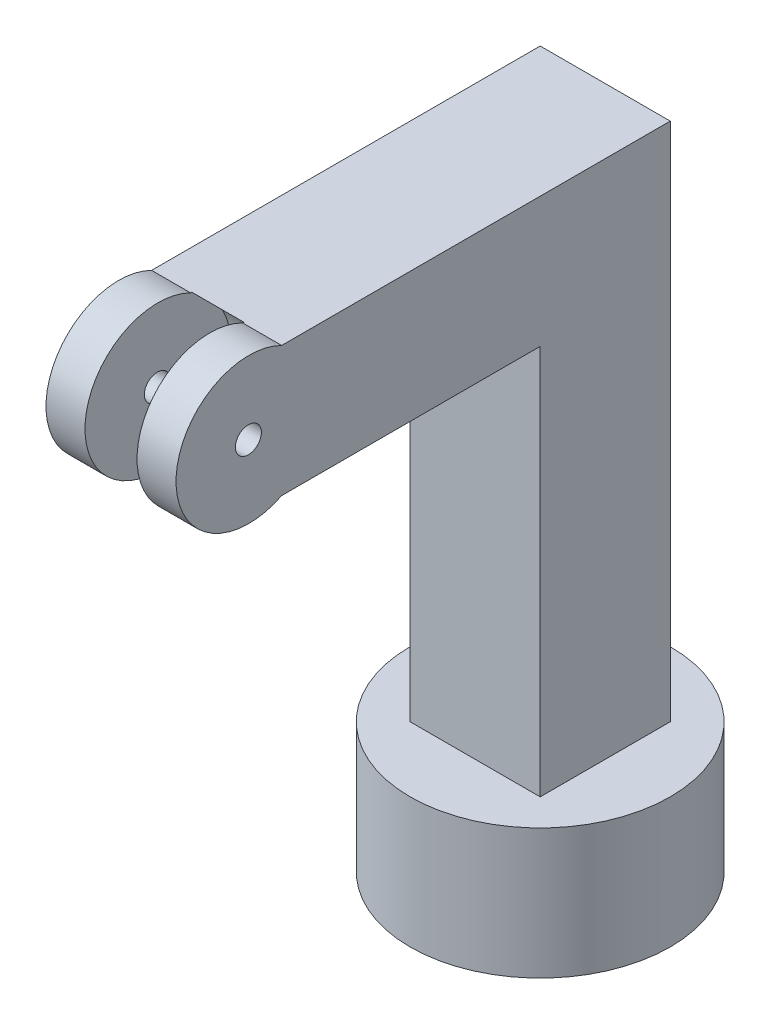
ISO-10303-21;
HEADER;
FILE_DESCRIPTION(('STEP AP214'),'2;1');
FILE_NAME('part.step','',(''),(''),'','','');
FILE_SCHEMA(('AUTOMOTIVE_DESIGN { 1 0 10303 214 1 1 1 1 }'));
ENDSEC;
DATA;
#1=APPLICATION_CONTEXT('core data for automotive mechanical design processes');
#2=APPLICATION_PROTOCOL_DEFINITION('international standard','automotive_design',2000,#1);
#3=PRODUCT_CONTEXT('',#1,'mechanical');
#4=PRODUCT('Part','Part','',(#3));
#5=PRODUCT_RELATED_PRODUCT_CATEGORY('part','',(#4));
#6=PRODUCT_DEFINITION_FORMATION('','',#4);
#7=PRODUCT_DEFINITION_CONTEXT('part definition',#1,'design');
#8=PRODUCT_DEFINITION('design','',#6,#7);
#9=PRODUCT_DEFINITION_SHAPE('','',#8);
#10=(LENGTH_UNIT() NAMED_UNIT(*) SI_UNIT(.MILLI.,.METRE.));
#11=(NAMED_UNIT(*) PLANE_ANGLE_UNIT() SI_UNIT($,.RADIAN.));
#12=(NAMED_UNIT(*) SI_UNIT($,.STERADIAN.) SOLID_ANGLE_UNIT());
#13=UNCERTAINTY_MEASURE_WITH_UNIT(LENGTH_MEASURE(1.E-05),#10,'distance_accuracy_value','');
#14=(GEOMETRIC_REPRESENTATION_CONTEXT(3) GLOBAL_UNCERTAINTY_ASSIGNED_CONTEXT((#13)) GLOBAL_UNIT_ASSIGNED_CONTEXT((#10,
#11,#12)) REPRESENTATION_CONTEXT('',''));
#15=CARTESIAN_POINT('',(0.,0.,0.));
#16=DIRECTION('',(0.,0.,1.));
#17=DIRECTION('',(1.,0.,0.));
#18=AXIS2_PLACEMENT_3D('',#15,#16,#17);
#19=CARTESIAN_POINT('',(0.,125.,0.));
#20=DIRECTION('',(0.,-1.,0.));
#21=DIRECTION('',(0.,0.,-1.));
#22=AXIS2_PLACEMENT_3D('',#19,#20,#21);
#23=PLANE('',#22);
#24=DIRECTION('',(0.,0.,1.));
#25=VECTOR('',#24,1.);
#26=CARTESIAN_POINT('',(-5.,125.,0.));
#27=LINE('',#26,#25);
#28=CARTESIAN_POINT('',(-5.,125.,61.9640635273143));
#29=VERTEX_POINT('',#28);
#30=CARTESIAN_POINT('',(-5.,125.,62.1952398935408));
#31=VERTEX_POINT('',#30);
#32=EDGE_CURVE('E131',#29,#31,#27,.T.);
#33=ORIENTED_EDGE('',*,*,#32,.F.);
#34=DIRECTION('',(1.,0.,0.));
#35=VECTOR('',#34,1.);
#36=CARTESIAN_POINT('',(-5.,125.,61.9640635273143));
#37=LINE('',#36,#35);
#38=CARTESIAN_POINT('',(5.,125.,61.9640635273143));
#39=VERTEX_POINT('',#38);
#40=EDGE_CURVE('E124',#29,#39,#37,.T.);
#41=ORIENTED_EDGE('',*,*,#40,.T.);
#42=DIRECTION('',(0.,0.,1.));
#43=VECTOR('',#42,1.);
#44=CARTESIAN_POINT('',(5.,125.,0.));
#45=LINE('',#44,#43);
#46=CARTESIAN_POINT('',(5.,125.,62.1952398935408));
#47=VERTEX_POINT('',#46);
#48=EDGE_CURVE('E113',#39,#47,#45,.T.);
#49=ORIENTED_EDGE('',*,*,#48,.T.);
#50=DIRECTION('',(-1.,0.,0.));
#51=VECTOR('',#50,1.);
#52=CARTESIAN_POINT('',(12.5,125.,62.1952398935408));
#53=LINE('',#52,#51);
#54=CARTESIAN_POINT('',(12.5,125.,62.1952398935408));
#55=VERTEX_POINT('',#54);
#56=EDGE_CURVE('E60',#55,#47,#53,.T.);
#57=ORIENTED_EDGE('',*,*,#56,.F.);
#58=DIRECTION('',(0.,0.,-1.));
#59=VECTOR('',#58,1.);
#60=CARTESIAN_POINT('',(12.5,125.,-12.5));
#61=LINE('',#60,#59);
#62=CARTESIAN_POINT('',(12.5,125.,-12.5));
#63=VERTEX_POINT('',#62);
#64=EDGE_CURVE('E161',#55,#63,#61,.T.);
#65=ORIENTED_EDGE('',*,*,#64,.T.);
#66=DIRECTION('',(-1.,0.,0.));
#67=VECTOR('',#66,1.);
#68=CARTESIAN_POINT('',(12.5,125.,-12.5));
#69=LINE('',#68,#67);
#70=CARTESIAN_POINT('',(-12.5,125.,-12.5));
#71=VERTEX_POINT('',#70);
#72=EDGE_CURVE('E164',#63,#71,#69,.T.);
#73=ORIENTED_EDGE('',*,*,#72,.T.);
#74=DIRECTION('',(0.,0.,1.));
#75=VECTOR('',#74,1.);
#76=CARTESIAN_POINT('',(-12.5,125.,-12.5));
#77=LINE('',#76,#75);
#78=CARTESIAN_POINT('',(-12.5,125.,62.1952398935408));
#79=VERTEX_POINT('',#78);
#80=EDGE_CURVE('E158',#71,#79,#77,.T.);
#81=ORIENTED_EDGE('',*,*,#80,.T.);
#82=EDGE_CURVE('E141',#31,#79,#53,.T.);
#83=ORIENTED_EDGE('',*,*,#82,.F.);
#84=EDGE_LOOP('',(#33,#41,#49,#57,#65,#73,#81,#83));
#85=FACE_BOUND('',#84,.T.);
#86=ADVANCED_FACE('F36',(#85),#23,.F.);
#87=CARTESIAN_POINT('',(-12.5,100.,62.5));
#88=DIRECTION('',(0.,1.,0.));
#89=DIRECTION('',(0.,0.,1.));
#90=AXIS2_PLACEMENT_3D('',#87,#88,#89);
#91=PLANE('',#90);
#92=DIRECTION('',(0.,0.,-1.));
#93=VECTOR('',#92,1.);
#94=CARTESIAN_POINT('',(-5.,100.,62.5));
#95=LINE('',#94,#93);
#96=CARTESIAN_POINT('',(-5.,100.,62.1952398935408));
#97=VERTEX_POINT('',#96);
#98=CARTESIAN_POINT('',(-5.,100.,61.9640635273143));
#99=VERTEX_POINT('',#98);
#100=EDGE_CURVE('E119',#97,#99,#95,.T.);
#101=ORIENTED_EDGE('',*,*,#100,.F.);
#102=DIRECTION('',(-1.,0.,0.));
#103=VECTOR('',#102,1.);
#104=CARTESIAN_POINT('',(12.5,100.,62.1952398935408));
#105=LINE('',#104,#103);
#106=CARTESIAN_POINT('',(-12.5,100.,62.1952398935408));
#107=VERTEX_POINT('',#106);
#108=EDGE_CURVE('E193',#107,#97,#105,.F.);
#109=ORIENTED_EDGE('',*,*,#108,.F.);
#110=DIRECTION('',(0.,0.,-1.));
#111=VECTOR('',#110,1.);
#112=CARTESIAN_POINT('',(-12.5,100.,62.5));
#113=LINE('',#112,#111);
#114=CARTESIAN_POINT('',(-12.5,100.,12.5));
#115=VERTEX_POINT('',#114);
#116=EDGE_CURVE('E149',#107,#115,#113,.T.);
#117=ORIENTED_EDGE('',*,*,#116,.T.);
#118=DIRECTION('',(1.,0.,0.));
#119=VECTOR('',#118,1.);
#120=CARTESIAN_POINT('',(-12.5,100.,12.5));
#121=LINE('',#120,#119);
#122=CARTESIAN_POINT('',(12.5,100.,12.5));
#123=VERTEX_POINT('',#122);
#124=EDGE_CURVE('E144',#115,#123,#121,.T.);
#125=ORIENTED_EDGE('',*,*,#124,.T.);
#126=DIRECTION('',(0.,0.,-1.));
#127=VECTOR('',#126,1.);
#128=CARTESIAN_POINT('',(12.5,100.,62.5));
#129=LINE('',#128,#127);
#130=CARTESIAN_POINT('',(12.5,100.,62.1952398935408));
#131=VERTEX_POINT('',#130);
#132=EDGE_CURVE('E147',#131,#123,#129,.T.);
#133=ORIENTED_EDGE('',*,*,#132,.F.);
#134=CARTESIAN_POINT('',(5.,100.,62.1952398935408));
#135=VERTEX_POINT('',#134);
#136=EDGE_CURVE('E190',#135,#131,#105,.F.);
#137=ORIENTED_EDGE('',*,*,#136,.F.);
#138=DIRECTION('',(0.,0.,-1.));
#139=VECTOR('',#138,1.);
#140=CARTESIAN_POINT('',(5.,100.,62.5));
#141=LINE('',#140,#139);
#142=CARTESIAN_POINT('',(5.,100.,61.9640635273143));
#143=VERTEX_POINT('',#142);
#144=EDGE_CURVE('E52',#135,#143,#141,.T.);
#145=ORIENTED_EDGE('',*,*,#144,.T.);
#146=DIRECTION('',(1.,0.,0.));
#147=VECTOR('',#146,1.);
#148=CARTESIAN_POINT('',(-5.,100.,61.9640635273143));
#149=LINE('',#148,#147);
#150=EDGE_CURVE('E11',#143,#99,#149,.F.);
#151=ORIENTED_EDGE('',*,*,#150,.T.);
#152=EDGE_LOOP('',(#101,#109,#117,#125,#133,#137,#145,#151));
#153=FACE_BOUND('',#152,.T.);
#154=ADVANCED_FACE('F203',(#153),#91,.F.);
#155=CARTESIAN_POINT('',(12.5,112.5,68.5));
#156=DIRECTION('',(-1.,0.,0.));
#157=DIRECTION('',(0.,0.,1.));
#158=AXIS2_PLACEMENT_3D('',#155,#156,#157);
#159=CYLINDRICAL_SURFACE('',#158,14.);
#160=CARTESIAN_POINT('',(-5.,112.5,68.5));
#161=DIRECTION('',(1.,0.,0.));
#162=DIRECTION('',(0.,0.,-1.));
#163=AXIS2_PLACEMENT_3D('',#160,#161,#162);
#164=CIRCLE('',#163,14.);
#165=EDGE_CURVE('E45',#31,#97,#164,.T.);
#166=ORIENTED_EDGE('',*,*,#165,.F.);
#167=ORIENTED_EDGE('',*,*,#82,.T.);
#168=CARTESIAN_POINT('',(-12.5,112.5,68.5));
#169=DIRECTION('',(1.,0.,0.));
#170=DIRECTION('',(0.,0.,-1.));
#171=AXIS2_PLACEMENT_3D('',#168,#169,#170);
#172=CIRCLE('',#171,14.);
#173=EDGE_CURVE('E132',#79,#107,#172,.T.);
#174=ORIENTED_EDGE('',*,*,#173,.T.);
#175=ORIENTED_EDGE('',*,*,#108,.T.);
#176=EDGE_LOOP('',(#166,#167,#174,#175));
#177=FACE_BOUND('',#176,.T.);
#178=ADVANCED_FACE('F205',(#177),#159,.T.);
#179=CARTESIAN_POINT('',(12.5,125.,12.5));
#180=DIRECTION('',(0.,0.,-1.));
#181=DIRECTION('',(-1.,0.,0.));
#182=AXIS2_PLACEMENT_3D('',#179,#180,#181);
#183=PLANE('',#182);
#184=ORIENTED_EDGE('',*,*,#124,.F.);
#185=DIRECTION('',(0.,-1.,0.));
#186=VECTOR('',#185,1.);
#187=CARTESIAN_POINT('',(-12.5,125.,12.5));
#188=LINE('',#187,#186);
#189=CARTESIAN_POINT('',(-12.5,25.,12.5));
#190=VERTEX_POINT('',#189);
#191=EDGE_CURVE('E184',#115,#190,#188,.T.);
#192=ORIENTED_EDGE('',*,*,#191,.T.);
#193=DIRECTION('',(1.,0.,0.));
#194=VECTOR('',#193,1.);
#195=CARTESIAN_POINT('',(12.5,25.,12.5));
#196=LINE('',#195,#194);
#197=CARTESIAN_POINT('',(12.5,25.,12.5));
#198=VERTEX_POINT('',#197);
#199=EDGE_CURVE('E169',#190,#198,#196,.T.);
#200=ORIENTED_EDGE('',*,*,#199,.T.);
#201=DIRECTION('',(0.,-1.,0.));
#202=VECTOR('',#201,1.);
#203=CARTESIAN_POINT('',(12.5,125.,12.5));
#204=LINE('',#203,#202);
#205=EDGE_CURVE('E182',#123,#198,#204,.T.);
#206=ORIENTED_EDGE('',*,*,#205,.F.);
#207=EDGE_LOOP('',(#184,#192,#200,#206));
#208=FACE_BOUND('',#207,.T.);
#209=ADVANCED_FACE('F215',(#208),#183,.F.);
#210=CARTESIAN_POINT('',(0.,25.,0.));
#211=DIRECTION('',(0.,-1.,0.));
#212=DIRECTION('',(0.,0.,-1.));
#213=AXIS2_PLACEMENT_3D('',#210,#211,#212);
#214=CYLINDRICAL_SURFACE('',#213,25.);
#215=CARTESIAN_POINT('',(0.,25.,0.));
#216=DIRECTION('',(0.,1.,0.));
#217=DIRECTION('',(0.,0.,1.));
#218=AXIS2_PLACEMENT_3D('',#215,#216,#217);
#219=CIRCLE('',#218,25.);
#220=CARTESIAN_POINT('',(0.,25.,25.));
#221=VERTEX_POINT('',#220);
#222=EDGE_CURVE('E187',#221,#221,#219,.T.);
#223=ORIENTED_EDGE('',*,*,#222,.F.);
#224=EDGE_LOOP('',(#223));
#225=FACE_BOUND('',#224,.T.);
#226=CARTESIAN_POINT('',(0.,0.,0.));
#227=DIRECTION('',(0.,1.,0.));
#228=DIRECTION('',(0.,0.,1.));
#229=AXIS2_PLACEMENT_3D('',#226,#227,#228);
#230=CIRCLE('',#229,25.);
#231=CARTESIAN_POINT('',(0.,0.,25.));
#232=VERTEX_POINT('',#231);
#233=EDGE_CURVE('E186',#232,#232,#230,.T.);
#234=ORIENTED_EDGE('',*,*,#233,.T.);
#235=EDGE_LOOP('',(#234));
#236=FACE_BOUND('',#235,.T.);
#237=ADVANCED_FACE('F38',(#225,#236),#214,.T.);
#238=CARTESIAN_POINT('',(0.,25.,0.));
#239=DIRECTION('',(0.,1.,0.));
#240=DIRECTION('',(0.,0.,1.));
#241=AXIS2_PLACEMENT_3D('',#238,#239,#240);
#242=PLANE('',#241);
#243=DIRECTION('',(0.,0.,1.));
#244=VECTOR('',#243,1.);
#245=CARTESIAN_POINT('',(-12.5,25.,-12.5));
#246=LINE('',#245,#244);
#247=CARTESIAN_POINT('',(-12.5,25.,-12.5));
#248=VERTEX_POINT('',#247);
#249=EDGE_CURVE('E155',#248,#190,#246,.T.);
#250=ORIENTED_EDGE('',*,*,#249,.F.);
#251=DIRECTION('',(-1.,0.,0.));
#252=VECTOR('',#251,1.);
#253=CARTESIAN_POINT('',(12.5,25.,-12.5));
#254=LINE('',#253,#252);
#255=CARTESIAN_POINT('',(12.5,25.,-12.5));
#256=VERTEX_POINT('',#255);
#257=EDGE_CURVE('E162',#256,#248,#254,.T.);
#258=ORIENTED_EDGE('',*,*,#257,.F.);
#259=DIRECTION('',(0.,0.,-1.));
#260=VECTOR('',#259,1.);
#261=CARTESIAN_POINT('',(12.5,25.,-12.5));
#262=LINE('',#261,#260);
#263=EDGE_CURVE('E172',#198,#256,#262,.T.);
#264=ORIENTED_EDGE('',*,*,#263,.F.);
#265=ORIENTED_EDGE('',*,*,#199,.F.);
#266=EDGE_LOOP('',(#250,#258,#264,#265));
#267=FACE_BOUND('',#266,.T.);
#268=ORIENTED_EDGE('',*,*,#222,.T.);
#269=EDGE_LOOP('',(#268));
#270=FACE_BOUND('',#269,.T.);
#271=ADVANCED_FACE('F222',(#267,#270),#242,.T.);
#272=CARTESIAN_POINT('',(0.,0.,0.));
#273=DIRECTION('',(0.,1.,0.));
#274=DIRECTION('',(0.,0.,1.));
#275=AXIS2_PLACEMENT_3D('',#272,#273,#274);
#276=PLANE('',#275);
#277=CARTESIAN_POINT('',(0.,0.,0.));
#278=DIRECTION('',(0.,-1.,0.));
#279=DIRECTION('',(0.,0.,-1.));
#280=AXIS2_PLACEMENT_3D('',#277,#278,#279);
#281=CIRCLE('',#280,5.);
#282=CARTESIAN_POINT('',(0.,0.,-5.));
#283=VERTEX_POINT('',#282);
#284=EDGE_CURVE('E151',#283,#283,#281,.T.);
#285=ORIENTED_EDGE('',*,*,#284,.F.);
#286=EDGE_LOOP('',(#285));
#287=FACE_BOUND('',#286,.T.);
#288=ORIENTED_EDGE('',*,*,#233,.F.);
#289=EDGE_LOOP('',(#288));
#290=FACE_BOUND('',#289,.T.);
#291=ADVANCED_FACE('F263',(#287,#290),#276,.F.);
#292=CARTESIAN_POINT('',(-12.5,125.,-12.5));
#293=DIRECTION('',(1.,0.,0.));
#294=DIRECTION('',(0.,0.,-1.));
#295=AXIS2_PLACEMENT_3D('',#292,#293,#294);
#296=PLANE('',#295);
#297=CARTESIAN_POINT('',(-12.5,112.5,68.5952398935408));
#298=DIRECTION('',(1.,0.,0.));
#299=DIRECTION('',(0.,0.,-1.));
#300=AXIS2_PLACEMENT_3D('',#297,#298,#299);
#301=CIRCLE('',#300,2.50000000000001);
#302=CARTESIAN_POINT('',(-12.5,112.5,66.0952398935407));
#303=VERTEX_POINT('',#302);
#304=EDGE_CURVE('E127',#303,#303,#301,.T.);
#305=ORIENTED_EDGE('',*,*,#304,.T.);
#306=EDGE_LOOP('',(#305));
#307=FACE_BOUND('',#306,.T.);
#308=ORIENTED_EDGE('',*,*,#116,.F.);
#309=ORIENTED_EDGE('',*,*,#173,.F.);
#310=ORIENTED_EDGE('',*,*,#80,.F.);
#311=DIRECTION('',(0.,-1.,0.));
#312=VECTOR('',#311,1.);
#313=CARTESIAN_POINT('',(-12.5,125.,-12.5));
#314=LINE('',#313,#312);
#315=EDGE_CURVE('E166',#71,#248,#314,.T.);
#316=ORIENTED_EDGE('',*,*,#315,.T.);
#317=ORIENTED_EDGE('',*,*,#249,.T.);
#318=ORIENTED_EDGE('',*,*,#191,.F.);
#319=EDGE_LOOP('',(#308,#309,#310,#316,#317,#318));
#320=FACE_BOUND('',#319,.T.);
#321=ADVANCED_FACE('F209',(#307,#320),#296,.F.);
#322=CARTESIAN_POINT('',(12.5,125.,-12.5));
#323=DIRECTION('',(-1.,0.,0.));
#324=DIRECTION('',(0.,0.,1.));
#325=AXIS2_PLACEMENT_3D('',#322,#323,#324);
#326=PLANE('',#325);
#327=CARTESIAN_POINT('',(12.5,112.5,68.5952398935408));
#328=DIRECTION('',(-1.,0.,0.));
#329=DIRECTION('',(0.,0.,1.));
#330=AXIS2_PLACEMENT_3D('',#327,#328,#329);
#331=CIRCLE('',#330,2.50000000000001);
#332=CARTESIAN_POINT('',(12.5,112.5,71.0952398935408));
#333=VERTEX_POINT('',#332);
#334=EDGE_CURVE('E237',#333,#333,#331,.T.);
#335=ORIENTED_EDGE('',*,*,#334,.T.);
#336=EDGE_LOOP('',(#335));
#337=FACE_BOUND('',#336,.T.);
#338=ORIENTED_EDGE('',*,*,#64,.F.);
#339=CARTESIAN_POINT('',(12.5,112.5,68.5));
#340=DIRECTION('',(1.,0.,0.));
#341=DIRECTION('',(0.,0.,-1.));
#342=AXIS2_PLACEMENT_3D('',#339,#340,#341);
#343=CIRCLE('',#342,14.);
#344=EDGE_CURVE('E135',#55,#131,#343,.T.);
#345=ORIENTED_EDGE('',*,*,#344,.T.);
#346=ORIENTED_EDGE('',*,*,#132,.T.);
#347=ORIENTED_EDGE('',*,*,#205,.T.);
#348=ORIENTED_EDGE('',*,*,#263,.T.);
#349=DIRECTION('',(0.,-1.,0.));
#350=VECTOR('',#349,1.);
#351=CARTESIAN_POINT('',(12.5,125.,-12.5));
#352=LINE('',#351,#350);
#353=EDGE_CURVE('E179',#63,#256,#352,.T.);
#354=ORIENTED_EDGE('',*,*,#353,.F.);
#355=EDGE_LOOP('',(#338,#345,#346,#347,#348,#354));
#356=FACE_BOUND('',#355,.T.);
#357=ADVANCED_FACE('F219',(#337,#356),#326,.F.);
#358=CARTESIAN_POINT('',(12.5,125.,-12.5));
#359=DIRECTION('',(0.,0.,1.));
#360=DIRECTION('',(1.,0.,0.));
#361=AXIS2_PLACEMENT_3D('',#358,#359,#360);
#362=PLANE('',#361);
#363=ORIENTED_EDGE('',*,*,#257,.T.);
#364=ORIENTED_EDGE('',*,*,#315,.F.);
#365=ORIENTED_EDGE('',*,*,#72,.F.);
#366=ORIENTED_EDGE('',*,*,#353,.T.);
#367=EDGE_LOOP('',(#363,#364,#365,#366));
#368=FACE_BOUND('',#367,.T.);
#369=ADVANCED_FACE('F226',(#368),#362,.F.);
#370=CARTESIAN_POINT('',(0.,10.,0.));
#371=DIRECTION('',(0.,-1.,0.));
#372=DIRECTION('',(0.,0.,-1.));
#373=AXIS2_PLACEMENT_3D('',#370,#371,#372);
#374=CYLINDRICAL_SURFACE('',#373,5.);
#375=CARTESIAN_POINT('',(0.,10.,0.));
#376=DIRECTION('',(0.,-1.,0.));
#377=DIRECTION('',(0.,0.,-1.));
#378=AXIS2_PLACEMENT_3D('',#375,#376,#377);
#379=CIRCLE('',#378,5.);
#380=CARTESIAN_POINT('',(0.,10.,-5.));
#381=VERTEX_POINT('',#380);
#382=EDGE_CURVE('E152',#381,#381,#379,.T.);
#383=ORIENTED_EDGE('',*,*,#382,.F.);
#384=EDGE_LOOP('',(#383));
#385=FACE_BOUND('',#384,.T.);
#386=ORIENTED_EDGE('',*,*,#284,.T.);
#387=EDGE_LOOP('',(#386));
#388=FACE_BOUND('',#387,.T.);
#389=ADVANCED_FACE('F261',(#385,#388),#374,.F.);
#390=CARTESIAN_POINT('',(0.,10.,0.));
#391=DIRECTION('',(0.,-1.,0.));
#392=DIRECTION('',(0.,0.,-1.));
#393=AXIS2_PLACEMENT_3D('',#390,#391,#392);
#394=PLANE('',#393);
#395=ORIENTED_EDGE('',*,*,#382,.T.);
#396=EDGE_LOOP('',(#395));
#397=FACE_BOUND('',#396,.T.);
#398=ADVANCED_FACE('F276',(#397),#394,.T.);
#399=ORIENTED_EDGE('',*,*,#56,.T.);
#400=CARTESIAN_POINT('',(5.,112.5,68.5));
#401=DIRECTION('',(1.,0.,0.));
#402=DIRECTION('',(0.,0.,-1.));
#403=AXIS2_PLACEMENT_3D('',#400,#401,#402);
#404=CIRCLE('',#403,14.);
#405=EDGE_CURVE('E117',#47,#135,#404,.T.);
#406=ORIENTED_EDGE('',*,*,#405,.T.);
#407=ORIENTED_EDGE('',*,*,#136,.T.);
#408=ORIENTED_EDGE('',*,*,#344,.F.);
#409=EDGE_LOOP('',(#399,#406,#407,#408));
#410=FACE_BOUND('',#409,.T.);
#411=ADVANCED_FACE('F230',(#410),#159,.T.);
#412=CARTESIAN_POINT('',(-5.,112.5,68.5952398935408));
#413=DIRECTION('',(1.,0.,0.));
#414=DIRECTION('',(0.,0.,-1.));
#415=AXIS2_PLACEMENT_3D('',#412,#413,#414);
#416=CYLINDRICAL_SURFACE('',#415,14.15);
#417=CARTESIAN_POINT('',(-5.,112.5,68.5952398935408));
#418=DIRECTION('',(1.,0.,0.));
#419=DIRECTION('',(0.,0.,-1.));
#420=AXIS2_PLACEMENT_3D('',#417,#418,#419);
#421=CIRCLE('',#420,14.15);
#422=EDGE_CURVE('E126',#99,#29,#421,.T.);
#423=ORIENTED_EDGE('',*,*,#422,.F.);
#424=ORIENTED_EDGE('',*,*,#150,.F.);
#425=CARTESIAN_POINT('',(5.,112.5,68.5952398935408));
#426=DIRECTION('',(1.,0.,0.));
#427=DIRECTION('',(0.,0.,-1.));
#428=AXIS2_PLACEMENT_3D('',#425,#426,#427);
#429=CIRCLE('',#428,14.15);
#430=EDGE_CURVE('E116',#143,#39,#429,.T.);
#431=ORIENTED_EDGE('',*,*,#430,.T.);
#432=ORIENTED_EDGE('',*,*,#40,.F.);
#433=EDGE_LOOP('',(#423,#424,#431,#432));
#434=FACE_BOUND('',#433,.T.);
#435=ADVANCED_FACE('F123',(#434),#416,.F.);
#436=CARTESIAN_POINT('',(-5.,112.5,68.5952398935408));
#437=DIRECTION('',(1.,0.,0.));
#438=DIRECTION('',(0.,0.,-1.));
#439=AXIS2_PLACEMENT_3D('',#436,#437,#438);
#440=PLANE('',#439);
#441=CARTESIAN_POINT('',(-5.,112.5,68.5952398935408));
#442=DIRECTION('',(1.,0.,0.));
#443=DIRECTION('',(0.,0.,-1.));
#444=AXIS2_PLACEMENT_3D('',#441,#442,#443);
#445=CIRCLE('',#444,2.50000000000001);
#446=CARTESIAN_POINT('',(-5.,112.5,66.0952398935407));
#447=VERTEX_POINT('',#446);
#448=EDGE_CURVE('E240',#447,#447,#445,.T.);
#449=ORIENTED_EDGE('',*,*,#448,.F.);
#450=EDGE_LOOP('',(#449));
#451=FACE_BOUND('',#450,.T.);
#452=ORIENTED_EDGE('',*,*,#32,.T.);
#453=ORIENTED_EDGE('',*,*,#165,.T.);
#454=ORIENTED_EDGE('',*,*,#100,.T.);
#455=ORIENTED_EDGE('',*,*,#422,.T.);
#456=EDGE_LOOP('',(#452,#453,#454,#455));
#457=FACE_BOUND('',#456,.T.);
#458=ADVANCED_FACE('F200',(#451,#457),#440,.T.);
#459=CARTESIAN_POINT('',(5.,112.5,68.5952398935408));
#460=DIRECTION('',(1.,0.,0.));
#461=DIRECTION('',(0.,0.,-1.));
#462=AXIS2_PLACEMENT_3D('',#459,#460,#461);
#463=PLANE('',#462);
#464=CARTESIAN_POINT('',(5.,112.5,68.5952398935408));
#465=DIRECTION('',(1.,0.,0.));
#466=DIRECTION('',(0.,0.,-1.));
#467=AXIS2_PLACEMENT_3D('',#464,#465,#466);
#468=CIRCLE('',#467,2.50000000000001);
#469=CARTESIAN_POINT('',(5.,112.5,66.0952398935407));
#470=VERTEX_POINT('',#469);
#471=EDGE_CURVE('E40',#470,#470,#468,.T.);
#472=ORIENTED_EDGE('',*,*,#471,.T.);
#473=EDGE_LOOP('',(#472));
#474=FACE_BOUND('',#473,.T.);
#475=ORIENTED_EDGE('',*,*,#430,.F.);
#476=ORIENTED_EDGE('',*,*,#144,.F.);
#477=ORIENTED_EDGE('',*,*,#405,.F.);
#478=ORIENTED_EDGE('',*,*,#48,.F.);
#479=EDGE_LOOP('',(#475,#476,#477,#478));
#480=FACE_BOUND('',#479,.T.);
#481=ADVANCED_FACE('F115',(#474,#480),#463,.F.);
#482=CARTESIAN_POINT('',(-25.,112.5,68.5952398935408));
#483=DIRECTION('',(1.,0.,0.));
#484=DIRECTION('',(0.,0.,-1.));
#485=AXIS2_PLACEMENT_3D('',#482,#483,#484);
#486=CYLINDRICAL_SURFACE('',#485,2.50000000000001);
#487=ORIENTED_EDGE('',*,*,#471,.F.);
#488=EDGE_LOOP('',(#487));
#489=FACE_BOUND('',#488,.T.);
#490=ORIENTED_EDGE('',*,*,#334,.F.);
#491=EDGE_LOOP('',(#490));
#492=FACE_BOUND('',#491,.T.);
#493=ADVANCED_FACE('F248',(#489,#492),#486,.F.);
#494=ORIENTED_EDGE('',*,*,#448,.T.);
#495=EDGE_LOOP('',(#494));
#496=FACE_BOUND('',#495,.T.);
#497=ORIENTED_EDGE('',*,*,#304,.F.);
#498=EDGE_LOOP('',(#497));
#499=FACE_BOUND('',#498,.T.);
#500=ADVANCED_FACE('F251',(#496,#499),#486,.F.);
#501=CLOSED_SHELL('',(#86,#154,#178,#209,#237,#271,#291,#321,#357,#369,#389,#398,#411,#435,#458,
#481,#493,#500));
#502=MANIFOLD_SOLID_BREP('B2',#501);
#503=ADVANCED_BREP_SHAPE_REPRESENTATION('',(#18,#502),#14);
#504=SHAPE_DEFINITION_REPRESENTATION(#9,#503);
ENDSEC;
END-ISO-10303-21;
